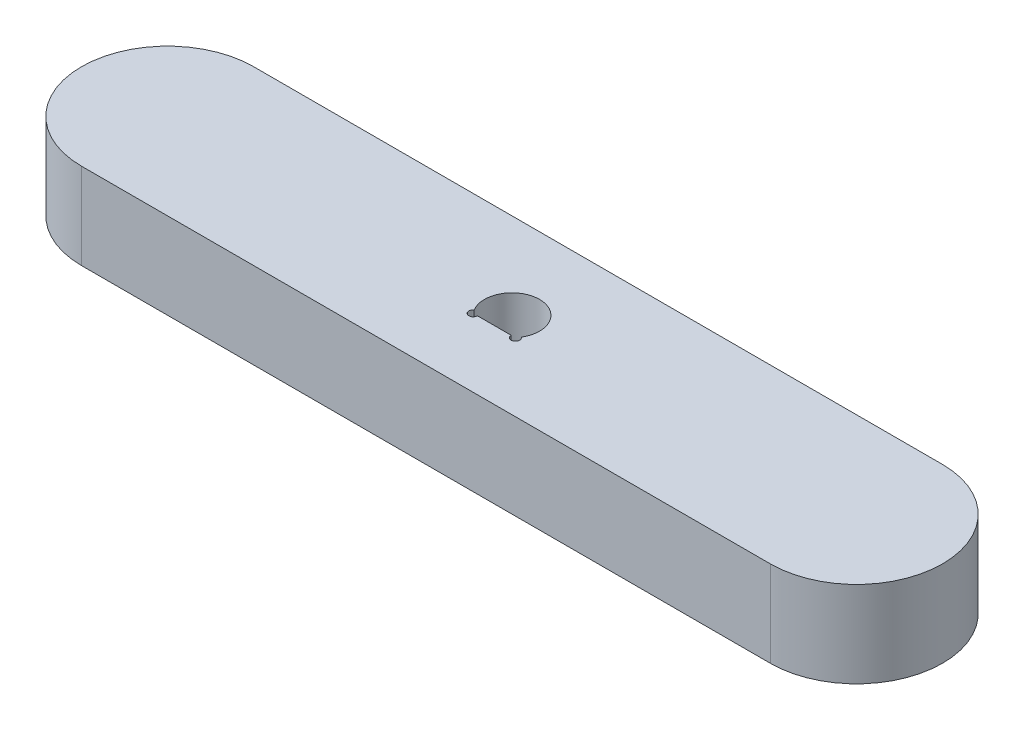
ISO-10303-21;
HEADER;
FILE_DESCRIPTION(('STEP AP214'),'2;1');
FILE_NAME('part.step','',(''),(''),'','','');
FILE_SCHEMA(('AUTOMOTIVE_DESIGN { 1 0 10303 214 1 1 1 1 }'));
ENDSEC;
DATA;
#1=APPLICATION_CONTEXT('core data for automotive mechanical design processes');
#2=APPLICATION_PROTOCOL_DEFINITION('international standard','automotive_design',2000,#1);
#3=PRODUCT_CONTEXT('',#1,'mechanical');
#4=PRODUCT('Part','Part','',(#3));
#5=PRODUCT_RELATED_PRODUCT_CATEGORY('part','',(#4));
#6=PRODUCT_DEFINITION_FORMATION('','',#4);
#7=PRODUCT_DEFINITION_CONTEXT('part definition',#1,'design');
#8=PRODUCT_DEFINITION('design','',#6,#7);
#9=PRODUCT_DEFINITION_SHAPE('','',#8);
#10=(LENGTH_UNIT() NAMED_UNIT(*) SI_UNIT(.MILLI.,.METRE.));
#11=(NAMED_UNIT(*) PLANE_ANGLE_UNIT() SI_UNIT($,.RADIAN.));
#12=(NAMED_UNIT(*) SI_UNIT($,.STERADIAN.) SOLID_ANGLE_UNIT());
#13=UNCERTAINTY_MEASURE_WITH_UNIT(LENGTH_MEASURE(1.E-05),#10,'distance_accuracy_value','');
#14=(GEOMETRIC_REPRESENTATION_CONTEXT(3) GLOBAL_UNCERTAINTY_ASSIGNED_CONTEXT((#13)) GLOBAL_UNIT_ASSIGNED_CONTEXT((#10,
#11,#12)) REPRESENTATION_CONTEXT('',''));
#15=CARTESIAN_POINT('',(0.,0.,0.));
#16=DIRECTION('',(0.,0.,1.));
#17=DIRECTION('',(1.,0.,0.));
#18=AXIS2_PLACEMENT_3D('',#15,#16,#17);
#19=CARTESIAN_POINT('',(-40.,5.,0.));
#20=DIRECTION('',(0.,-1.,0.));
#21=DIRECTION('',(0.,0.,-1.));
#22=AXIS2_PLACEMENT_3D('',#19,#20,#21);
#23=CYLINDRICAL_SURFACE('',#22,5.);
#24=CARTESIAN_POINT('',(-40.,0.,0.));
#25=DIRECTION('',(0.,1.,0.));
#26=DIRECTION('',(0.,0.,1.));
#27=AXIS2_PLACEMENT_3D('',#24,#25,#26);
#28=CIRCLE('',#27,5.);
#29=CARTESIAN_POINT('',(-40.,0.,-5.));
#30=VERTEX_POINT('',#29);
#31=CARTESIAN_POINT('',(-40.,0.,5.));
#32=VERTEX_POINT('',#31);
#33=EDGE_CURVE('E137',#30,#32,#28,.T.);
#34=ORIENTED_EDGE('',*,*,#33,.T.);
#35=DIRECTION('',(0.,-1.,0.));
#36=VECTOR('',#35,1.);
#37=CARTESIAN_POINT('',(-40.,5.,5.));
#38=LINE('',#37,#36);
#39=CARTESIAN_POINT('',(-40.,5.,5.));
#40=VERTEX_POINT('',#39);
#41=EDGE_CURVE('E11',#40,#32,#38,.T.);
#42=ORIENTED_EDGE('',*,*,#41,.F.);
#43=CARTESIAN_POINT('',(-40.,5.,0.));
#44=DIRECTION('',(0.,1.,0.));
#45=DIRECTION('',(0.,0.,1.));
#46=AXIS2_PLACEMENT_3D('',#43,#44,#45);
#47=CIRCLE('',#46,5.);
#48=CARTESIAN_POINT('',(-40.,5.,-5.));
#49=VERTEX_POINT('',#48);
#50=EDGE_CURVE('E131',#49,#40,#47,.T.);
#51=ORIENTED_EDGE('',*,*,#50,.F.);
#52=DIRECTION('',(0.,-1.,0.));
#53=VECTOR('',#52,1.);
#54=CARTESIAN_POINT('',(-40.,5.,-5.));
#55=LINE('',#54,#53);
#56=EDGE_CURVE('E123',#49,#30,#55,.T.);
#57=ORIENTED_EDGE('',*,*,#56,.T.);
#58=EDGE_LOOP('',(#34,#42,#51,#57));
#59=FACE_BOUND('',#58,.T.);
#60=ADVANCED_FACE('F45',(#59),#23,.T.);
#61=CARTESIAN_POINT('',(-40.,5.,5.));
#62=DIRECTION('',(0.,0.,-1.));
#63=DIRECTION('',(-1.,0.,0.));
#64=AXIS2_PLACEMENT_3D('',#61,#62,#63);
#65=PLANE('',#64);
#66=DIRECTION('',(1.,0.,0.));
#67=VECTOR('',#66,1.);
#68=CARTESIAN_POINT('',(-40.,0.,5.));
#69=LINE('',#68,#67);
#70=CARTESIAN_POINT('',(0.,0.,5.));
#71=VERTEX_POINT('',#70);
#72=EDGE_CURVE('E143',#32,#71,#69,.T.);
#73=ORIENTED_EDGE('',*,*,#72,.T.);
#74=DIRECTION('',(0.,-1.,0.));
#75=VECTOR('',#74,1.);
#76=CARTESIAN_POINT('',(0.,5.,5.));
#77=LINE('',#76,#75);
#78=CARTESIAN_POINT('',(0.,5.,5.));
#79=VERTEX_POINT('',#78);
#80=EDGE_CURVE('E55',#79,#71,#77,.T.);
#81=ORIENTED_EDGE('',*,*,#80,.F.);
#82=DIRECTION('',(1.,0.,0.));
#83=VECTOR('',#82,1.);
#84=CARTESIAN_POINT('',(-40.,5.,5.));
#85=LINE('',#84,#83);
#86=EDGE_CURVE('E167',#40,#79,#85,.T.);
#87=ORIENTED_EDGE('',*,*,#86,.F.);
#88=ORIENTED_EDGE('',*,*,#41,.T.);
#89=EDGE_LOOP('',(#73,#81,#87,#88));
#90=FACE_BOUND('',#89,.T.);
#91=ADVANCED_FACE('F166',(#90),#65,.F.);
#92=CARTESIAN_POINT('',(0.,5.,0.));
#93=DIRECTION('',(0.,-1.,0.));
#94=DIRECTION('',(0.,0.,-1.));
#95=AXIS2_PLACEMENT_3D('',#92,#93,#94);
#96=CYLINDRICAL_SURFACE('',#95,5.);
#97=CARTESIAN_POINT('',(0.,0.,0.));
#98=DIRECTION('',(0.,1.,0.));
#99=DIRECTION('',(0.,0.,1.));
#100=AXIS2_PLACEMENT_3D('',#97,#98,#99);
#101=CIRCLE('',#100,5.);
#102=CARTESIAN_POINT('',(0.,0.,-5.));
#103=VERTEX_POINT('',#102);
#104=EDGE_CURVE('E132',#71,#103,#101,.T.);
#105=ORIENTED_EDGE('',*,*,#104,.T.);
#106=DIRECTION('',(0.,-1.,0.));
#107=VECTOR('',#106,1.);
#108=CARTESIAN_POINT('',(0.,5.,-5.));
#109=LINE('',#108,#107);
#110=CARTESIAN_POINT('',(0.,5.,-5.));
#111=VERTEX_POINT('',#110);
#112=EDGE_CURVE('E126',#111,#103,#109,.T.);
#113=ORIENTED_EDGE('',*,*,#112,.F.);
#114=CARTESIAN_POINT('',(0.,5.,0.));
#115=DIRECTION('',(0.,1.,0.));
#116=DIRECTION('',(0.,0.,1.));
#117=AXIS2_PLACEMENT_3D('',#114,#115,#116);
#118=CIRCLE('',#117,5.);
#119=EDGE_CURVE('E164',#79,#111,#118,.T.);
#120=ORIENTED_EDGE('',*,*,#119,.F.);
#121=ORIENTED_EDGE('',*,*,#80,.T.);
#122=EDGE_LOOP('',(#105,#113,#120,#121));
#123=FACE_BOUND('',#122,.T.);
#124=ADVANCED_FACE('F163',(#123),#96,.T.);
#125=CARTESIAN_POINT('',(-40.,5.,-5.));
#126=DIRECTION('',(0.,0.,1.));
#127=DIRECTION('',(1.,0.,0.));
#128=AXIS2_PLACEMENT_3D('',#125,#126,#127);
#129=PLANE('',#128);
#130=DIRECTION('',(-1.,0.,0.));
#131=VECTOR('',#130,1.);
#132=CARTESIAN_POINT('',(-40.,0.,-5.));
#133=LINE('',#132,#131);
#134=EDGE_CURVE('E119',#103,#30,#133,.T.);
#135=ORIENTED_EDGE('',*,*,#134,.T.);
#136=ORIENTED_EDGE('',*,*,#56,.F.);
#137=DIRECTION('',(-1.,0.,0.));
#138=VECTOR('',#137,1.);
#139=CARTESIAN_POINT('',(-40.,5.,-5.));
#140=LINE('',#139,#138);
#141=EDGE_CURVE('E140',#111,#49,#140,.T.);
#142=ORIENTED_EDGE('',*,*,#141,.F.);
#143=ORIENTED_EDGE('',*,*,#112,.T.);
#144=EDGE_LOOP('',(#135,#136,#142,#143));
#145=FACE_BOUND('',#144,.T.);
#146=ADVANCED_FACE('F121',(#145),#129,.F.);
#147=CARTESIAN_POINT('',(-40.,5.,0.));
#148=DIRECTION('',(0.,1.,0.));
#149=DIRECTION('',(0.,0.,1.));
#150=AXIS2_PLACEMENT_3D('',#147,#148,#149);
#151=PLANE('',#150);
#152=CARTESIAN_POINT('',(-18.775,5.,1.02925944251195));
#153=DIRECTION('',(0.,1.,0.));
#154=DIRECTION('',(0.,0.,1.));
#155=AXIS2_PLACEMENT_3D('',#152,#153,#154);
#156=CIRCLE('',#155,0.25);
#157=CARTESIAN_POINT('',(-19.025,5.,1.02925944251195));
#158=VERTEX_POINT('',#157);
#159=CARTESIAN_POINT('',(-18.6296233657154,5.,0.82587400988692));
#160=VERTEX_POINT('',#159);
#161=EDGE_CURVE('E145',#158,#160,#156,.T.);
#162=ORIENTED_EDGE('',*,*,#161,.F.);
#163=DIRECTION('',(1.,0.,0.));
#164=VECTOR('',#163,1.);
#165=CARTESIAN_POINT('',(-40.,5.,1.02925944251195));
#166=LINE('',#165,#164);
#167=CARTESIAN_POINT('',(-20.975,5.,1.02925944251195));
#168=VERTEX_POINT('',#167);
#169=EDGE_CURVE('E48',#158,#168,#166,.F.);
#170=ORIENTED_EDGE('',*,*,#169,.T.);
#171=CARTESIAN_POINT('',(-21.225,5.,1.02925944251195));
#172=DIRECTION('',(0.,1.,0.));
#173=DIRECTION('',(0.,0.,1.));
#174=AXIS2_PLACEMENT_3D('',#171,#172,#173);
#175=CIRCLE('',#174,0.25);
#176=CARTESIAN_POINT('',(-21.3703766342846,5.,0.82587400988692));
#177=VERTEX_POINT('',#176);
#178=EDGE_CURVE('E82',#177,#168,#175,.T.);
#179=ORIENTED_EDGE('',*,*,#178,.F.);
#180=CARTESIAN_POINT('',(-20.,5.,0.));
#181=DIRECTION('',(0.,1.,0.));
#182=DIRECTION('',(0.,0.,1.));
#183=AXIS2_PLACEMENT_3D('',#180,#181,#182);
#184=CIRCLE('',#183,1.6);
#185=EDGE_CURVE('E179',#160,#177,#184,.T.);
#186=ORIENTED_EDGE('',*,*,#185,.F.);
#187=EDGE_LOOP('',(#162,#170,#179,#186));
#188=FACE_BOUND('',#187,.T.);
#189=ORIENTED_EDGE('',*,*,#50,.T.);
#190=ORIENTED_EDGE('',*,*,#86,.T.);
#191=ORIENTED_EDGE('',*,*,#119,.T.);
#192=ORIENTED_EDGE('',*,*,#141,.T.);
#193=EDGE_LOOP('',(#189,#190,#191,#192));
#194=FACE_BOUND('',#193,.T.);
#195=ADVANCED_FACE('F171',(#188,#194),#151,.T.);
#196=CARTESIAN_POINT('',(-40.,0.,0.));
#197=DIRECTION('',(0.,1.,0.));
#198=DIRECTION('',(0.,0.,1.));
#199=AXIS2_PLACEMENT_3D('',#196,#197,#198);
#200=PLANE('',#199);
#201=DIRECTION('',(-1.,0.,0.));
#202=VECTOR('',#201,1.);
#203=CARTESIAN_POINT('',(0.,0.,1.02925944251195));
#204=LINE('',#203,#202);
#205=CARTESIAN_POINT('',(-19.025,0.,1.02925944251195));
#206=VERTEX_POINT('',#205);
#207=CARTESIAN_POINT('',(-20.975,0.,1.02925944251195));
#208=VERTEX_POINT('',#207);
#209=EDGE_CURVE('E191',#206,#208,#204,.T.);
#210=ORIENTED_EDGE('',*,*,#209,.F.);
#211=CARTESIAN_POINT('',(-18.775,0.,1.02925944251195));
#212=DIRECTION('',(0.,1.,0.));
#213=DIRECTION('',(0.,0.,1.));
#214=AXIS2_PLACEMENT_3D('',#211,#212,#213);
#215=CIRCLE('',#214,0.25);
#216=CARTESIAN_POINT('',(-18.6296233657154,0.,0.82587400988692));
#217=VERTEX_POINT('',#216);
#218=EDGE_CURVE('E204',#206,#217,#215,.T.);
#219=ORIENTED_EDGE('',*,*,#218,.T.);
#220=CARTESIAN_POINT('',(-20.,0.,0.));
#221=DIRECTION('',(0.,1.,0.));
#222=DIRECTION('',(0.,0.,1.));
#223=AXIS2_PLACEMENT_3D('',#220,#221,#222);
#224=CIRCLE('',#223,1.6);
#225=CARTESIAN_POINT('',(-21.3703766342846,0.,0.82587400988692));
#226=VERTEX_POINT('',#225);
#227=EDGE_CURVE('E200',#217,#226,#224,.T.);
#228=ORIENTED_EDGE('',*,*,#227,.T.);
#229=CARTESIAN_POINT('',(-21.225,0.,1.02925944251195));
#230=DIRECTION('',(0.,1.,0.));
#231=DIRECTION('',(0.,0.,1.));
#232=AXIS2_PLACEMENT_3D('',#229,#230,#231);
#233=CIRCLE('',#232,0.25);
#234=EDGE_CURVE('E196',#226,#208,#233,.T.);
#235=ORIENTED_EDGE('',*,*,#234,.T.);
#236=EDGE_LOOP('',(#210,#219,#228,#235));
#237=FACE_BOUND('',#236,.T.);
#238=ORIENTED_EDGE('',*,*,#33,.F.);
#239=ORIENTED_EDGE('',*,*,#134,.F.);
#240=ORIENTED_EDGE('',*,*,#104,.F.);
#241=ORIENTED_EDGE('',*,*,#72,.F.);
#242=EDGE_LOOP('',(#238,#239,#240,#241));
#243=FACE_BOUND('',#242,.T.);
#244=ADVANCED_FACE('F142',(#237,#243),#200,.F.);
#245=CARTESIAN_POINT('',(-18.775,0.,1.02925944251195));
#246=DIRECTION('',(0.,1.,0.));
#247=DIRECTION('',(0.,0.,1.));
#248=AXIS2_PLACEMENT_3D('',#245,#246,#247);
#249=CYLINDRICAL_SURFACE('',#248,0.25);
#250=ORIENTED_EDGE('',*,*,#161,.T.);
#251=DIRECTION('',(0.,1.,0.));
#252=VECTOR('',#251,1.);
#253=CARTESIAN_POINT('',(-18.6296233657154,0.,0.82587400988692));
#254=LINE('',#253,#252);
#255=EDGE_CURVE('E63',#217,#160,#254,.T.);
#256=ORIENTED_EDGE('',*,*,#255,.F.);
#257=ORIENTED_EDGE('',*,*,#218,.F.);
#258=DIRECTION('',(0.,1.,0.));
#259=VECTOR('',#258,1.);
#260=CARTESIAN_POINT('',(-19.025,0.,1.02925944251195));
#261=LINE('',#260,#259);
#262=EDGE_CURVE('E182',#206,#158,#261,.T.);
#263=ORIENTED_EDGE('',*,*,#262,.T.);
#264=EDGE_LOOP('',(#250,#256,#257,#263));
#265=FACE_BOUND('',#264,.T.);
#266=ADVANCED_FACE('F209',(#265),#249,.F.);
#267=CARTESIAN_POINT('',(0.,0.,1.02925944251195));
#268=DIRECTION('',(0.,0.,-1.));
#269=DIRECTION('',(-1.,0.,0.));
#270=AXIS2_PLACEMENT_3D('',#267,#268,#269);
#271=PLANE('',#270);
#272=ORIENTED_EDGE('',*,*,#262,.F.);
#273=ORIENTED_EDGE('',*,*,#209,.T.);
#274=DIRECTION('',(0.,1.,0.));
#275=VECTOR('',#274,1.);
#276=CARTESIAN_POINT('',(-20.975,0.,1.02925944251195));
#277=LINE('',#276,#275);
#278=EDGE_CURVE('E185',#208,#168,#277,.T.);
#279=ORIENTED_EDGE('',*,*,#278,.T.);
#280=ORIENTED_EDGE('',*,*,#169,.F.);
#281=EDGE_LOOP('',(#272,#273,#279,#280));
#282=FACE_BOUND('',#281,.T.);
#283=ADVANCED_FACE('F216',(#282),#271,.T.);
#284=CARTESIAN_POINT('',(-21.225,0.,1.02925944251195));
#285=DIRECTION('',(0.,1.,0.));
#286=DIRECTION('',(0.,0.,1.));
#287=AXIS2_PLACEMENT_3D('',#284,#285,#286);
#288=CYLINDRICAL_SURFACE('',#287,0.25);
#289=ORIENTED_EDGE('',*,*,#178,.T.);
#290=ORIENTED_EDGE('',*,*,#278,.F.);
#291=ORIENTED_EDGE('',*,*,#234,.F.);
#292=DIRECTION('',(0.,1.,0.));
#293=VECTOR('',#292,1.);
#294=CARTESIAN_POINT('',(-21.3703766342846,0.,0.82587400988692));
#295=LINE('',#294,#293);
#296=EDGE_CURVE('E188',#226,#177,#295,.T.);
#297=ORIENTED_EDGE('',*,*,#296,.T.);
#298=EDGE_LOOP('',(#289,#290,#291,#297));
#299=FACE_BOUND('',#298,.T.);
#300=ADVANCED_FACE('F215',(#299),#288,.F.);
#301=CARTESIAN_POINT('',(-20.,0.,0.));
#302=DIRECTION('',(0.,1.,0.));
#303=DIRECTION('',(0.,0.,1.));
#304=AXIS2_PLACEMENT_3D('',#301,#302,#303);
#305=CYLINDRICAL_SURFACE('',#304,1.6);
#306=ORIENTED_EDGE('',*,*,#185,.T.);
#307=ORIENTED_EDGE('',*,*,#296,.F.);
#308=ORIENTED_EDGE('',*,*,#227,.F.);
#309=ORIENTED_EDGE('',*,*,#255,.T.);
#310=EDGE_LOOP('',(#306,#307,#308,#309));
#311=FACE_BOUND('',#310,.T.);
#312=ADVANCED_FACE('F214',(#311),#305,.F.);
#313=CLOSED_SHELL('',(#60,#91,#124,#146,#195,#244,#266,#283,#300,#312));
#314=MANIFOLD_SOLID_BREP('B2',#313);
#315=ADVANCED_BREP_SHAPE_REPRESENTATION('',(#18,#314),#14);
#316=SHAPE_DEFINITION_REPRESENTATION(#9,#315);
ENDSEC;
END-ISO-10303-21;
